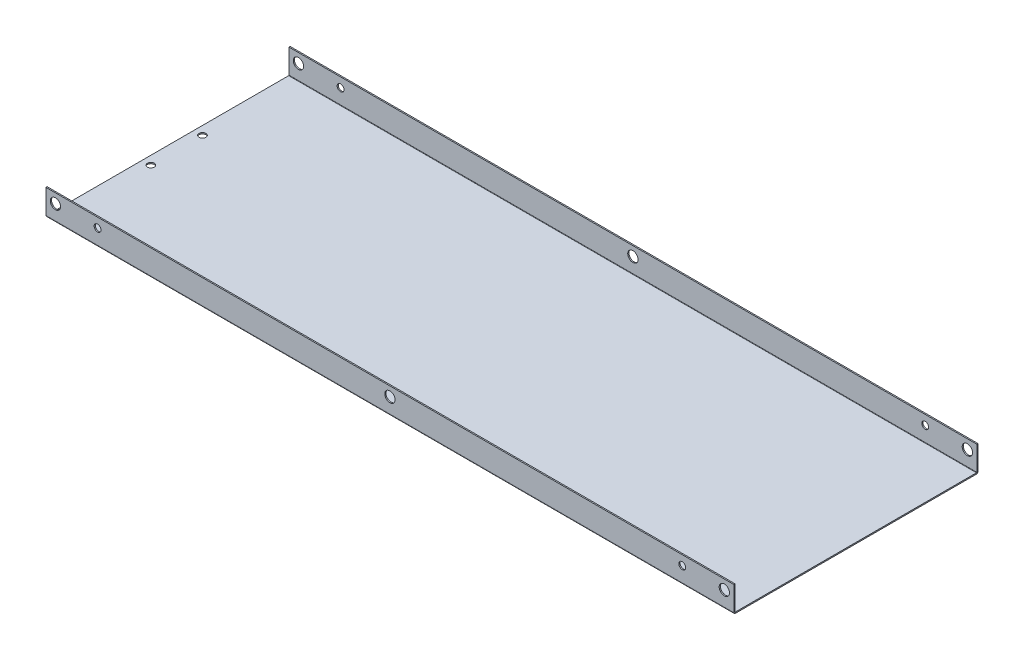
ISO-10303-21;
HEADER;
FILE_DESCRIPTION(('STEP AP214'),'2;1');
FILE_NAME('part.step','',(''),(''),'','','');
FILE_SCHEMA(('AUTOMOTIVE_DESIGN { 1 0 10303 214 1 1 1 1 }'));
ENDSEC;
DATA;
#1=APPLICATION_CONTEXT('core data for automotive mechanical design processes');
#2=APPLICATION_PROTOCOL_DEFINITION('international standard','automotive_design',2000,#1);
#3=PRODUCT_CONTEXT('',#1,'mechanical');
#4=PRODUCT('Part','Part','',(#3));
#5=PRODUCT_RELATED_PRODUCT_CATEGORY('part','',(#4));
#6=PRODUCT_DEFINITION_FORMATION('','',#4);
#7=PRODUCT_DEFINITION_CONTEXT('part definition',#1,'design');
#8=PRODUCT_DEFINITION('design','',#6,#7);
#9=PRODUCT_DEFINITION_SHAPE('','',#8);
#10=(LENGTH_UNIT() NAMED_UNIT(*) SI_UNIT(.MILLI.,.METRE.));
#11=(NAMED_UNIT(*) PLANE_ANGLE_UNIT() SI_UNIT($,.RADIAN.));
#12=(NAMED_UNIT(*) SI_UNIT($,.STERADIAN.) SOLID_ANGLE_UNIT());
#13=UNCERTAINTY_MEASURE_WITH_UNIT(LENGTH_MEASURE(1.E-05),#10,'distance_accuracy_value','');
#14=(GEOMETRIC_REPRESENTATION_CONTEXT(3) GLOBAL_UNCERTAINTY_ASSIGNED_CONTEXT((#13)) GLOBAL_UNIT_ASSIGNED_CONTEXT((#10,
#11,#12)) REPRESENTATION_CONTEXT('',''));
#15=CARTESIAN_POINT('',(0.,0.,0.));
#16=DIRECTION('',(0.,0.,1.));
#17=DIRECTION('',(1.,0.,0.));
#18=AXIS2_PLACEMENT_3D('',#15,#16,#17);
#19=CARTESIAN_POINT('',(0.,-0.7,0.));
#20=DIRECTION('',(0.,-1.,0.));
#21=DIRECTION('',(0.,0.,-1.));
#22=AXIS2_PLACEMENT_3D('',#19,#20,#21);
#23=PLANE('',#22);
#24=CARTESIAN_POINT('',(-195.,-0.699999999999999,-15.));
#25=DIRECTION('',(0.,-1.,0.));
#26=DIRECTION('',(0.,0.,-1.));
#27=AXIS2_PLACEMENT_3D('',#24,#25,#26);
#28=CIRCLE('',#27,2.);
#29=CARTESIAN_POINT('',(-195.,-0.699999999999999,-17.));
#30=VERTEX_POINT('',#29);
#31=EDGE_CURVE('E328',#30,#30,#28,.T.);
#32=ORIENTED_EDGE('',*,*,#31,.F.);
#33=EDGE_LOOP('',(#32));
#34=FACE_BOUND('',#33,.T.);
#35=CARTESIAN_POINT('',(-195.,-0.699999999999999,15.));
#36=DIRECTION('',(0.,-1.,0.));
#37=DIRECTION('',(0.,0.,-1.));
#38=AXIS2_PLACEMENT_3D('',#35,#36,#37);
#39=CIRCLE('',#38,2.);
#40=CARTESIAN_POINT('',(-195.,-0.699999999999999,13.));
#41=VERTEX_POINT('',#40);
#42=EDGE_CURVE('E556',#41,#41,#39,.T.);
#43=ORIENTED_EDGE('',*,*,#42,.F.);
#44=EDGE_LOOP('',(#43));
#45=FACE_BOUND('',#44,.T.);
#46=DIRECTION('',(0.,0.,-1.));
#47=VECTOR('',#46,1.);
#48=CARTESIAN_POINT('',(200.,-0.7,71.));
#49=LINE('',#48,#47);
#50=CARTESIAN_POINT('',(200.,-0.699999999999993,70.1));
#51=VERTEX_POINT('',#50);
#52=CARTESIAN_POINT('',(200.,-0.7,-70.1));
#53=VERTEX_POINT('',#52);
#54=EDGE_CURVE('E85',#51,#53,#49,.T.);
#55=ORIENTED_EDGE('',*,*,#54,.F.);
#56=DIRECTION('',(1.,0.,0.));
#57=VECTOR('',#56,1.);
#58=CARTESIAN_POINT('',(200.,-0.699999999999993,70.1));
#59=LINE('',#58,#57);
#60=CARTESIAN_POINT('',(-200.,-0.7,70.1));
#61=VERTEX_POINT('',#60);
#62=EDGE_CURVE('E210',#51,#61,#59,.F.);
#63=ORIENTED_EDGE('',*,*,#62,.T.);
#64=DIRECTION('',(0.,0.,1.));
#65=VECTOR('',#64,1.);
#66=CARTESIAN_POINT('',(-200.,-0.7,71.));
#67=LINE('',#66,#65);
#68=CARTESIAN_POINT('',(-200.,-0.700000000000022,-70.1));
#69=VERTEX_POINT('',#68);
#70=EDGE_CURVE('E13',#69,#61,#67,.T.);
#71=ORIENTED_EDGE('',*,*,#70,.F.);
#72=DIRECTION('',(-1.,0.,0.));
#73=VECTOR('',#72,1.);
#74=CARTESIAN_POINT('',(-200.,-0.700000000000022,-70.1));
#75=LINE('',#74,#73);
#76=EDGE_CURVE('E261',#69,#53,#75,.F.);
#77=ORIENTED_EDGE('',*,*,#76,.T.);
#78=EDGE_LOOP('',(#55,#63,#71,#77));
#79=FACE_BOUND('',#78,.T.);
#80=ADVANCED_FACE('F76',(#34,#45,#79),#23,.T.);
#81=CARTESIAN_POINT('',(0.,0.,0.));
#82=DIRECTION('',(0.,-1.,0.));
#83=DIRECTION('',(0.,0.,-1.));
#84=AXIS2_PLACEMENT_3D('',#81,#82,#83);
#85=PLANE('',#84);
#86=CARTESIAN_POINT('',(-195.,0.,-15.));
#87=DIRECTION('',(0.,1.,0.));
#88=DIRECTION('',(0.,0.,1.));
#89=AXIS2_PLACEMENT_3D('',#86,#87,#88);
#90=CIRCLE('',#89,2.);
#91=CARTESIAN_POINT('',(-195.,0.,-13.));
#92=VERTEX_POINT('',#91);
#93=EDGE_CURVE('E555',#92,#92,#90,.T.);
#94=ORIENTED_EDGE('',*,*,#93,.F.);
#95=EDGE_LOOP('',(#94));
#96=FACE_BOUND('',#95,.T.);
#97=CARTESIAN_POINT('',(-195.,0.,15.));
#98=DIRECTION('',(0.,1.,0.));
#99=DIRECTION('',(0.,0.,-1.));
#100=AXIS2_PLACEMENT_3D('',#97,#98,#99);
#101=CIRCLE('',#100,2.);
#102=CARTESIAN_POINT('',(-195.,0.,13.));
#103=VERTEX_POINT('',#102);
#104=EDGE_CURVE('E557',#103,#103,#101,.T.);
#105=ORIENTED_EDGE('',*,*,#104,.F.);
#106=EDGE_LOOP('',(#105));
#107=FACE_BOUND('',#106,.T.);
#108=DIRECTION('',(1.,0.,0.));
#109=VECTOR('',#108,1.);
#110=CARTESIAN_POINT('',(200.,0.,70.1));
#111=LINE('',#110,#109);
#112=CARTESIAN_POINT('',(200.,0.,70.1));
#113=VERTEX_POINT('',#112);
#114=CARTESIAN_POINT('',(-200.,0.,70.1));
#115=VERTEX_POINT('',#114);
#116=EDGE_CURVE('E221',#113,#115,#111,.F.);
#117=ORIENTED_EDGE('',*,*,#116,.F.);
#118=DIRECTION('',(0.,0.,-1.));
#119=VECTOR('',#118,1.);
#120=CARTESIAN_POINT('',(200.,0.,71.));
#121=LINE('',#120,#119);
#122=CARTESIAN_POINT('',(200.,0.,-70.1));
#123=VERTEX_POINT('',#122);
#124=EDGE_CURVE('E278',#113,#123,#121,.T.);
#125=ORIENTED_EDGE('',*,*,#124,.T.);
#126=DIRECTION('',(-1.,0.,0.));
#127=VECTOR('',#126,1.);
#128=CARTESIAN_POINT('',(-200.,0.,-70.1));
#129=LINE('',#128,#127);
#130=CARTESIAN_POINT('',(-200.,0.,-70.1));
#131=VERTEX_POINT('',#130);
#132=EDGE_CURVE('E272',#131,#123,#129,.F.);
#133=ORIENTED_EDGE('',*,*,#132,.F.);
#134=DIRECTION('',(0.,0.,1.));
#135=VECTOR('',#134,1.);
#136=CARTESIAN_POINT('',(-200.,0.,71.));
#137=LINE('',#136,#135);
#138=EDGE_CURVE('E282',#131,#115,#137,.T.);
#139=ORIENTED_EDGE('',*,*,#138,.T.);
#140=EDGE_LOOP('',(#117,#125,#133,#139));
#141=FACE_BOUND('',#140,.T.);
#142=ADVANCED_FACE('F376',(#96,#107,#141),#85,.F.);
#143=CARTESIAN_POINT('',(200.,-0.7,71.));
#144=DIRECTION('',(1.,0.,0.));
#145=DIRECTION('',(0.,0.,-1.));
#146=AXIS2_PLACEMENT_3D('',#143,#144,#145);
#147=PLANE('',#146);
#148=ORIENTED_EDGE('',*,*,#124,.F.);
#149=DIRECTION('',(0.,-1.,0.));
#150=VECTOR('',#149,1.);
#151=CARTESIAN_POINT('',(200.,0.,70.1));
#152=LINE('',#151,#150);
#153=EDGE_CURVE('E215',#113,#51,#152,.T.);
#154=ORIENTED_EDGE('',*,*,#153,.T.);
#155=ORIENTED_EDGE('',*,*,#54,.T.);
#156=DIRECTION('',(0.,-1.,0.));
#157=VECTOR('',#156,1.);
#158=CARTESIAN_POINT('',(200.,0.,-70.1));
#159=LINE('',#158,#157);
#160=EDGE_CURVE('E276',#123,#53,#159,.T.);
#161=ORIENTED_EDGE('',*,*,#160,.F.);
#162=EDGE_LOOP('',(#148,#154,#155,#161));
#163=FACE_BOUND('',#162,.T.);
#164=ADVANCED_FACE('F78',(#163),#147,.T.);
#165=CARTESIAN_POINT('',(-200.,-0.7,71.));
#166=DIRECTION('',(-1.,0.,0.));
#167=DIRECTION('',(0.,0.,1.));
#168=AXIS2_PLACEMENT_3D('',#165,#166,#167);
#169=PLANE('',#168);
#170=DIRECTION('',(0.,-1.,0.));
#171=VECTOR('',#170,1.);
#172=CARTESIAN_POINT('',(-200.,0.,70.1));
#173=LINE('',#172,#171);
#174=EDGE_CURVE('E226',#115,#61,#173,.T.);
#175=ORIENTED_EDGE('',*,*,#174,.F.);
#176=ORIENTED_EDGE('',*,*,#138,.F.);
#177=DIRECTION('',(0.,-1.,0.));
#178=VECTOR('',#177,1.);
#179=CARTESIAN_POINT('',(-200.,0.,-70.1));
#180=LINE('',#179,#178);
#181=EDGE_CURVE('E266',#131,#69,#180,.T.);
#182=ORIENTED_EDGE('',*,*,#181,.T.);
#183=ORIENTED_EDGE('',*,*,#70,.T.);
#184=EDGE_LOOP('',(#175,#176,#182,#183));
#185=FACE_BOUND('',#184,.T.);
#186=ADVANCED_FACE('F389',(#185),#169,.T.);
#187=CARTESIAN_POINT('',(200.,0.200000000000011,-70.1));
#188=DIRECTION('',(1.,0.,0.));
#189=DIRECTION('',(0.,1.,0.));
#190=AXIS2_PLACEMENT_3D('',#187,#188,#189);
#191=PLANE('',#190);
#192=DIRECTION('',(0.,0.,1.));
#193=VECTOR('',#192,1.);
#194=CARTESIAN_POINT('',(200.,0.200000000000011,-71.));
#195=LINE('',#194,#193);
#196=CARTESIAN_POINT('',(200.,0.20000000000001,-70.3));
#197=VERTEX_POINT('',#196);
#198=CARTESIAN_POINT('',(200.,0.200000000000007,-71.));
#199=VERTEX_POINT('',#198);
#200=EDGE_CURVE('E228',#197,#199,#195,.F.);
#201=ORIENTED_EDGE('',*,*,#200,.F.);
#202=CARTESIAN_POINT('',(200.,0.200000000000011,-70.1));
#203=DIRECTION('',(-1.,0.,0.));
#204=DIRECTION('',(0.,-1.,0.));
#205=AXIS2_PLACEMENT_3D('',#202,#203,#204);
#206=CIRCLE('',#205,0.200000000000006);
#207=EDGE_CURVE('E269',#123,#197,#206,.F.);
#208=ORIENTED_EDGE('',*,*,#207,.F.);
#209=ORIENTED_EDGE('',*,*,#160,.T.);
#210=CARTESIAN_POINT('',(200.,0.200000000000011,-70.1));
#211=DIRECTION('',(-1.,0.,0.));
#212=DIRECTION('',(0.,-1.,0.));
#213=AXIS2_PLACEMENT_3D('',#210,#211,#212);
#214=CIRCLE('',#213,0.900000000000006);
#215=EDGE_CURVE('E93',#53,#199,#214,.F.);
#216=ORIENTED_EDGE('',*,*,#215,.T.);
#217=EDGE_LOOP('',(#201,#208,#209,#216));
#218=FACE_BOUND('',#217,.T.);
#219=ADVANCED_FACE('F391',(#218),#191,.T.);
#220=CARTESIAN_POINT('',(-200.,0.199999999999984,-70.1));
#221=DIRECTION('',(1.,0.,0.));
#222=DIRECTION('',(0.,1.,0.));
#223=AXIS2_PLACEMENT_3D('',#220,#221,#222);
#224=PLANE('',#223);
#225=CARTESIAN_POINT('',(-200.,0.199999999999984,-70.1));
#226=DIRECTION('',(-1.,0.,0.));
#227=DIRECTION('',(0.,-1.,0.));
#228=AXIS2_PLACEMENT_3D('',#225,#226,#227);
#229=CIRCLE('',#228,0.200000000000006);
#230=CARTESIAN_POINT('',(-200.,0.199999999999983,-70.3));
#231=VERTEX_POINT('',#230);
#232=EDGE_CURVE('E234',#231,#131,#229,.T.);
#233=ORIENTED_EDGE('',*,*,#232,.F.);
#234=DIRECTION('',(0.,0.,1.));
#235=VECTOR('',#234,1.);
#236=CARTESIAN_POINT('',(-200.,0.199999999999992,-70.3));
#237=LINE('',#236,#235);
#238=CARTESIAN_POINT('',(-200.,0.199999999999997,-71.));
#239=VERTEX_POINT('',#238);
#240=EDGE_CURVE('E254',#231,#239,#237,.F.);
#241=ORIENTED_EDGE('',*,*,#240,.T.);
#242=CARTESIAN_POINT('',(-200.,0.199999999999984,-70.1));
#243=DIRECTION('',(-1.,0.,0.));
#244=DIRECTION('',(0.,-1.,0.));
#245=AXIS2_PLACEMENT_3D('',#242,#243,#244);
#246=CIRCLE('',#245,0.900000000000006);
#247=EDGE_CURVE('E264',#239,#69,#246,.T.);
#248=ORIENTED_EDGE('',*,*,#247,.T.);
#249=ORIENTED_EDGE('',*,*,#181,.F.);
#250=EDGE_LOOP('',(#233,#241,#248,#249));
#251=FACE_BOUND('',#250,.T.);
#252=ADVANCED_FACE('F387',(#251),#224,.F.);
#253=CARTESIAN_POINT('',(-200.,0.199999999999984,-70.1));
#254=DIRECTION('',(-1.,0.,0.));
#255=DIRECTION('',(0.,0.,-1.));
#256=AXIS2_PLACEMENT_3D('',#253,#254,#255);
#257=CYLINDRICAL_SURFACE('',#256,0.900000000000006);
#258=ORIENTED_EDGE('',*,*,#76,.F.);
#259=ORIENTED_EDGE('',*,*,#247,.F.);
#260=DIRECTION('',(-1.,0.,0.));
#261=VECTOR('',#260,1.);
#262=CARTESIAN_POINT('',(200.,0.200000000000011,-71.));
#263=LINE('',#262,#261);
#264=EDGE_CURVE('E252',#239,#199,#263,.F.);
#265=ORIENTED_EDGE('',*,*,#264,.T.);
#266=ORIENTED_EDGE('',*,*,#215,.F.);
#267=EDGE_LOOP('',(#258,#259,#265,#266));
#268=FACE_BOUND('',#267,.T.);
#269=ADVANCED_FACE('F440',(#268),#257,.T.);
#270=CARTESIAN_POINT('',(-200.,0.199999999999984,-70.1));
#271=DIRECTION('',(-1.,0.,0.));
#272=DIRECTION('',(0.,0.,-1.));
#273=AXIS2_PLACEMENT_3D('',#270,#271,#272);
#274=CYLINDRICAL_SURFACE('',#273,0.200000000000006);
#275=ORIENTED_EDGE('',*,*,#132,.T.);
#276=ORIENTED_EDGE('',*,*,#207,.T.);
#277=DIRECTION('',(-1.,0.,0.));
#278=VECTOR('',#277,1.);
#279=CARTESIAN_POINT('',(200.,0.200000000000006,-70.3));
#280=LINE('',#279,#278);
#281=EDGE_CURVE('E257',#197,#231,#280,.T.);
#282=ORIENTED_EDGE('',*,*,#281,.T.);
#283=ORIENTED_EDGE('',*,*,#232,.T.);
#284=EDGE_LOOP('',(#275,#276,#282,#283));
#285=FACE_BOUND('',#284,.T.);
#286=ADVANCED_FACE('F409',(#285),#274,.F.);
#287=CARTESIAN_POINT('',(-200.,14.3,-71.));
#288=DIRECTION('',(1.,0.,0.));
#289=DIRECTION('',(0.,0.,-1.));
#290=AXIS2_PLACEMENT_3D('',#287,#288,#289);
#291=PLANE('',#290);
#292=ORIENTED_EDGE('',*,*,#240,.F.);
#293=DIRECTION('',(0.,-1.,0.));
#294=VECTOR('',#293,1.);
#295=CARTESIAN_POINT('',(-200.,14.3,-70.3));
#296=LINE('',#295,#294);
#297=CARTESIAN_POINT('',(-200.,14.3,-70.3));
#298=VERTEX_POINT('',#297);
#299=EDGE_CURVE('E250',#231,#298,#296,.F.);
#300=ORIENTED_EDGE('',*,*,#299,.T.);
#301=DIRECTION('',(0.,0.,1.));
#302=VECTOR('',#301,1.);
#303=CARTESIAN_POINT('',(-200.,14.3,-71.));
#304=LINE('',#303,#302);
#305=CARTESIAN_POINT('',(-200.,14.3,-71.));
#306=VERTEX_POINT('',#305);
#307=EDGE_CURVE('E231',#306,#298,#304,.T.);
#308=ORIENTED_EDGE('',*,*,#307,.F.);
#309=DIRECTION('',(0.,1.,0.));
#310=VECTOR('',#309,1.);
#311=CARTESIAN_POINT('',(-200.,-2.78058843749729E-13,-71.));
#312=LINE('',#311,#310);
#313=EDGE_CURVE('E243',#239,#306,#312,.T.);
#314=ORIENTED_EDGE('',*,*,#313,.F.);
#315=EDGE_LOOP('',(#292,#300,#308,#314));
#316=FACE_BOUND('',#315,.T.);
#317=ADVANCED_FACE('F432',(#316),#291,.F.);
#318=CARTESIAN_POINT('',(200.,0.,-71.));
#319=DIRECTION('',(-1.,0.,0.));
#320=DIRECTION('',(0.,-1.,0.));
#321=AXIS2_PLACEMENT_3D('',#318,#319,#320);
#322=PLANE('',#321);
#323=ORIENTED_EDGE('',*,*,#200,.T.);
#324=DIRECTION('',(0.,-1.,0.));
#325=VECTOR('',#324,1.);
#326=CARTESIAN_POINT('',(200.,-6.66248712499784E-13,-71.));
#327=LINE('',#326,#325);
#328=CARTESIAN_POINT('',(200.,14.3,-71.));
#329=VERTEX_POINT('',#328);
#330=EDGE_CURVE('E238',#329,#199,#327,.T.);
#331=ORIENTED_EDGE('',*,*,#330,.F.);
#332=DIRECTION('',(0.,0.,1.));
#333=VECTOR('',#332,1.);
#334=CARTESIAN_POINT('',(200.,14.3,-71.));
#335=LINE('',#334,#333);
#336=CARTESIAN_POINT('',(200.,14.3,-70.3));
#337=VERTEX_POINT('',#336);
#338=EDGE_CURVE('E235',#329,#337,#335,.T.);
#339=ORIENTED_EDGE('',*,*,#338,.T.);
#340=DIRECTION('',(0.,1.,0.));
#341=VECTOR('',#340,1.);
#342=CARTESIAN_POINT('',(200.,0.,-70.3));
#343=LINE('',#342,#341);
#344=EDGE_CURVE('E245',#337,#197,#343,.F.);
#345=ORIENTED_EDGE('',*,*,#344,.T.);
#346=EDGE_LOOP('',(#323,#331,#339,#345));
#347=FACE_BOUND('',#346,.T.);
#348=ADVANCED_FACE('F414',(#347),#322,.F.);
#349=CARTESIAN_POINT('',(0.,-2.78058843749729E-13,-71.));
#350=DIRECTION('',(0.,0.,1.));
#351=DIRECTION('',(0.,-1.,0.));
#352=AXIS2_PLACEMENT_3D('',#349,#350,#351);
#353=PLANE('',#352);
#354=CARTESIAN_POINT('',(170.,8.80000000000001,-71.));
#355=DIRECTION('',(0.,0.,-1.));
#356=DIRECTION('',(0.,1.,0.));
#357=AXIS2_PLACEMENT_3D('',#354,#355,#356);
#358=CIRCLE('',#357,2.);
#359=CARTESIAN_POINT('',(170.,10.8,-71.));
#360=VERTEX_POINT('',#359);
#361=EDGE_CURVE('E312',#360,#360,#358,.T.);
#362=ORIENTED_EDGE('',*,*,#361,.F.);
#363=EDGE_LOOP('',(#362));
#364=FACE_BOUND('',#363,.T.);
#365=CARTESIAN_POINT('',(-170.,8.80000000000005,-71.));
#366=DIRECTION('',(0.,0.,-1.));
#367=DIRECTION('',(0.,-1.,0.));
#368=AXIS2_PLACEMENT_3D('',#365,#366,#367);
#369=CIRCLE('',#368,2.);
#370=CARTESIAN_POINT('',(-170.,6.80000000000005,-71.));
#371=VERTEX_POINT('',#370);
#372=EDGE_CURVE('E321',#371,#371,#369,.T.);
#373=ORIENTED_EDGE('',*,*,#372,.F.);
#374=EDGE_LOOP('',(#373));
#375=FACE_BOUND('',#374,.T.);
#376=CARTESIAN_POINT('',(194.5,8.8,-71.));
#377=DIRECTION('',(0.,0.,-1.));
#378=DIRECTION('',(0.,1.,0.));
#379=AXIS2_PLACEMENT_3D('',#376,#377,#378);
#380=CIRCLE('',#379,2.99999999999999);
#381=CARTESIAN_POINT('',(194.5,11.8,-71.));
#382=VERTEX_POINT('',#381);
#383=EDGE_CURVE('E292',#382,#382,#380,.T.);
#384=ORIENTED_EDGE('',*,*,#383,.F.);
#385=EDGE_LOOP('',(#384));
#386=FACE_BOUND('',#385,.T.);
#387=CARTESIAN_POINT('',(0.,8.80000000000001,-71.));
#388=DIRECTION('',(0.,0.,-1.));
#389=DIRECTION('',(0.,1.,0.));
#390=AXIS2_PLACEMENT_3D('',#387,#388,#389);
#391=CIRCLE('',#390,3.);
#392=CARTESIAN_POINT('',(0.,11.8,-71.));
#393=VERTEX_POINT('',#392);
#394=EDGE_CURVE('E346',#393,#393,#391,.T.);
#395=ORIENTED_EDGE('',*,*,#394,.F.);
#396=EDGE_LOOP('',(#395));
#397=FACE_BOUND('',#396,.T.);
#398=CARTESIAN_POINT('',(-194.5,8.80000000000005,-71.));
#399=DIRECTION('',(0.,0.,-1.));
#400=DIRECTION('',(0.,-1.,0.));
#401=AXIS2_PLACEMENT_3D('',#398,#399,#400);
#402=CIRCLE('',#401,2.99999999999999);
#403=CARTESIAN_POINT('',(-194.5,5.80000000000005,-71.));
#404=VERTEX_POINT('',#403);
#405=EDGE_CURVE('E307',#404,#404,#402,.T.);
#406=ORIENTED_EDGE('',*,*,#405,.F.);
#407=EDGE_LOOP('',(#406));
#408=FACE_BOUND('',#407,.T.);
#409=ORIENTED_EDGE('',*,*,#264,.F.);
#410=ORIENTED_EDGE('',*,*,#313,.T.);
#411=DIRECTION('',(1.,0.,0.));
#412=VECTOR('',#411,1.);
#413=CARTESIAN_POINT('',(0.,14.3,-71.));
#414=LINE('',#413,#412);
#415=EDGE_CURVE('E241',#306,#329,#414,.T.);
#416=ORIENTED_EDGE('',*,*,#415,.T.);
#417=ORIENTED_EDGE('',*,*,#330,.T.);
#418=EDGE_LOOP('',(#409,#410,#416,#417));
#419=FACE_BOUND('',#418,.T.);
#420=ADVANCED_FACE('F418',(#364,#375,#386,#397,#408,#419),#353,.F.);
#421=CARTESIAN_POINT('',(0.,-2.75614806812539E-13,-70.3));
#422=DIRECTION('',(0.,0.,1.));
#423=DIRECTION('',(0.,-1.,0.));
#424=AXIS2_PLACEMENT_3D('',#421,#422,#423);
#425=PLANE('',#424);
#426=CARTESIAN_POINT('',(170.,8.80000000000001,-70.3));
#427=DIRECTION('',(0.,0.,1.));
#428=DIRECTION('',(0.,-1.,0.));
#429=AXIS2_PLACEMENT_3D('',#426,#427,#428);
#430=CIRCLE('',#429,2.);
#431=CARTESIAN_POINT('',(170.,6.80000000000001,-70.3));
#432=VERTEX_POINT('',#431);
#433=EDGE_CURVE('E311',#432,#432,#430,.T.);
#434=ORIENTED_EDGE('',*,*,#433,.F.);
#435=EDGE_LOOP('',(#434));
#436=FACE_BOUND('',#435,.T.);
#437=CARTESIAN_POINT('',(-170.,8.80000000000005,-70.3));
#438=DIRECTION('',(0.,0.,1.));
#439=DIRECTION('',(0.,-1.,0.));
#440=AXIS2_PLACEMENT_3D('',#437,#438,#439);
#441=CIRCLE('',#440,2.);
#442=CARTESIAN_POINT('',(-170.,6.80000000000005,-70.3));
#443=VERTEX_POINT('',#442);
#444=EDGE_CURVE('E308',#443,#443,#441,.T.);
#445=ORIENTED_EDGE('',*,*,#444,.F.);
#446=EDGE_LOOP('',(#445));
#447=FACE_BOUND('',#446,.T.);
#448=CARTESIAN_POINT('',(194.5,8.8,-70.3));
#449=DIRECTION('',(0.,0.,1.));
#450=DIRECTION('',(0.,-1.,0.));
#451=AXIS2_PLACEMENT_3D('',#448,#449,#450);
#452=CIRCLE('',#451,2.99999999999999);
#453=CARTESIAN_POINT('',(194.5,5.80000000000001,-70.3));
#454=VERTEX_POINT('',#453);
#455=EDGE_CURVE('E209',#454,#454,#452,.T.);
#456=ORIENTED_EDGE('',*,*,#455,.F.);
#457=EDGE_LOOP('',(#456));
#458=FACE_BOUND('',#457,.T.);
#459=CARTESIAN_POINT('',(0.,8.80000000000001,-70.3));
#460=DIRECTION('',(0.,0.,1.));
#461=DIRECTION('',(0.,-1.,0.));
#462=AXIS2_PLACEMENT_3D('',#459,#460,#461);
#463=CIRCLE('',#462,3.);
#464=CARTESIAN_POINT('',(0.,5.80000000000001,-70.3));
#465=VERTEX_POINT('',#464);
#466=EDGE_CURVE('E291',#465,#465,#463,.T.);
#467=ORIENTED_EDGE('',*,*,#466,.F.);
#468=EDGE_LOOP('',(#467));
#469=FACE_BOUND('',#468,.T.);
#470=CARTESIAN_POINT('',(-194.5,8.80000000000005,-70.3));
#471=DIRECTION('',(0.,0.,1.));
#472=DIRECTION('',(0.,-1.,0.));
#473=AXIS2_PLACEMENT_3D('',#470,#471,#472);
#474=CIRCLE('',#473,2.99999999999999);
#475=CARTESIAN_POINT('',(-194.5,5.80000000000005,-70.3));
#476=VERTEX_POINT('',#475);
#477=EDGE_CURVE('E288',#476,#476,#474,.T.);
#478=ORIENTED_EDGE('',*,*,#477,.F.);
#479=EDGE_LOOP('',(#478));
#480=FACE_BOUND('',#479,.T.);
#481=ORIENTED_EDGE('',*,*,#299,.F.);
#482=ORIENTED_EDGE('',*,*,#281,.F.);
#483=ORIENTED_EDGE('',*,*,#344,.F.);
#484=DIRECTION('',(-1.,0.,0.));
#485=VECTOR('',#484,1.);
#486=CARTESIAN_POINT('',(200.,14.3,-70.3));
#487=LINE('',#486,#485);
#488=EDGE_CURVE('E248',#298,#337,#487,.F.);
#489=ORIENTED_EDGE('',*,*,#488,.F.);
#490=EDGE_LOOP('',(#481,#482,#483,#489));
#491=FACE_BOUND('',#490,.T.);
#492=ADVANCED_FACE('F428',(#436,#447,#458,#469,#480,#491),#425,.T.);
#493=CARTESIAN_POINT('',(200.,14.3,-71.));
#494=DIRECTION('',(0.,-1.,0.));
#495=DIRECTION('',(0.,0.,-1.));
#496=AXIS2_PLACEMENT_3D('',#493,#494,#495);
#497=PLANE('',#496);
#498=ORIENTED_EDGE('',*,*,#488,.T.);
#499=ORIENTED_EDGE('',*,*,#338,.F.);
#500=ORIENTED_EDGE('',*,*,#415,.F.);
#501=ORIENTED_EDGE('',*,*,#307,.T.);
#502=EDGE_LOOP('',(#498,#499,#500,#501));
#503=FACE_BOUND('',#502,.T.);
#504=ADVANCED_FACE('F424',(#503),#497,.F.);
#505=CARTESIAN_POINT('',(-200.,0.200000000000013,70.1));
#506=DIRECTION('',(-1.,0.,0.));
#507=DIRECTION('',(0.,0.,1.));
#508=AXIS2_PLACEMENT_3D('',#505,#506,#507);
#509=PLANE('',#508);
#510=DIRECTION('',(0.,0.,-1.));
#511=VECTOR('',#510,1.);
#512=CARTESIAN_POINT('',(-200.,0.200000000000006,71.));
#513=LINE('',#512,#511);
#514=CARTESIAN_POINT('',(-200.,0.200000000000013,70.3));
#515=VERTEX_POINT('',#514);
#516=CARTESIAN_POINT('',(-200.,0.200000000000013,71.));
#517=VERTEX_POINT('',#516);
#518=EDGE_CURVE('E191',#515,#517,#513,.F.);
#519=ORIENTED_EDGE('',*,*,#518,.F.);
#520=CARTESIAN_POINT('',(-200.,0.200000000000013,70.1));
#521=DIRECTION('',(1.,0.,0.));
#522=DIRECTION('',(0.,0.,-1.));
#523=AXIS2_PLACEMENT_3D('',#520,#521,#522);
#524=CIRCLE('',#523,0.200000000000006);
#525=EDGE_CURVE('E218',#115,#515,#524,.F.);
#526=ORIENTED_EDGE('',*,*,#525,.F.);
#527=ORIENTED_EDGE('',*,*,#174,.T.);
#528=CARTESIAN_POINT('',(-200.,0.200000000000013,70.1));
#529=DIRECTION('',(1.,0.,0.));
#530=DIRECTION('',(0.,0.,-1.));
#531=AXIS2_PLACEMENT_3D('',#528,#529,#530);
#532=CIRCLE('',#531,0.900000000000006);
#533=EDGE_CURVE('E101',#61,#517,#532,.F.);
#534=ORIENTED_EDGE('',*,*,#533,.T.);
#535=EDGE_LOOP('',(#519,#526,#527,#534));
#536=FACE_BOUND('',#535,.T.);
#537=ADVANCED_FACE('F450',(#536),#509,.T.);
#538=CARTESIAN_POINT('',(200.,0.200000000000013,70.1));
#539=DIRECTION('',(-1.,0.,0.));
#540=DIRECTION('',(0.,0.,1.));
#541=AXIS2_PLACEMENT_3D('',#538,#539,#540);
#542=PLANE('',#541);
#543=CARTESIAN_POINT('',(200.,0.200000000000013,70.1));
#544=DIRECTION('',(1.,0.,0.));
#545=DIRECTION('',(0.,0.,-1.));
#546=AXIS2_PLACEMENT_3D('',#543,#544,#545);
#547=CIRCLE('',#546,0.200000000000006);
#548=CARTESIAN_POINT('',(200.,0.200000000000013,70.3));
#549=VERTEX_POINT('',#548);
#550=EDGE_CURVE('E223',#549,#113,#547,.T.);
#551=ORIENTED_EDGE('',*,*,#550,.F.);
#552=DIRECTION('',(0.,0.,-1.));
#553=VECTOR('',#552,1.);
#554=CARTESIAN_POINT('',(200.,0.20000000000002,70.3));
#555=LINE('',#554,#553);
#556=CARTESIAN_POINT('',(200.,0.20000000000002,71.));
#557=VERTEX_POINT('',#556);
#558=EDGE_CURVE('E203',#549,#557,#555,.F.);
#559=ORIENTED_EDGE('',*,*,#558,.T.);
#560=CARTESIAN_POINT('',(200.,0.200000000000013,70.1));
#561=DIRECTION('',(1.,0.,0.));
#562=DIRECTION('',(0.,0.,-1.));
#563=AXIS2_PLACEMENT_3D('',#560,#561,#562);
#564=CIRCLE('',#563,0.900000000000006);
#565=EDGE_CURVE('E213',#557,#51,#564,.T.);
#566=ORIENTED_EDGE('',*,*,#565,.T.);
#567=ORIENTED_EDGE('',*,*,#153,.F.);
#568=EDGE_LOOP('',(#551,#559,#566,#567));
#569=FACE_BOUND('',#568,.T.);
#570=ADVANCED_FACE('F362',(#569),#542,.F.);
#571=CARTESIAN_POINT('',(200.,0.200000000000013,70.1));
#572=DIRECTION('',(1.,0.,0.));
#573=DIRECTION('',(0.,0.,1.));
#574=AXIS2_PLACEMENT_3D('',#571,#572,#573);
#575=CYLINDRICAL_SURFACE('',#574,0.900000000000006);
#576=ORIENTED_EDGE('',*,*,#62,.F.);
#577=ORIENTED_EDGE('',*,*,#565,.F.);
#578=DIRECTION('',(1.,0.,0.));
#579=VECTOR('',#578,1.);
#580=CARTESIAN_POINT('',(-200.,0.200000000000006,71.));
#581=LINE('',#580,#579);
#582=EDGE_CURVE('E201',#557,#517,#581,.F.);
#583=ORIENTED_EDGE('',*,*,#582,.T.);
#584=ORIENTED_EDGE('',*,*,#533,.F.);
#585=EDGE_LOOP('',(#576,#577,#583,#584));
#586=FACE_BOUND('',#585,.T.);
#587=ADVANCED_FACE('F371',(#586),#575,.T.);
#588=CARTESIAN_POINT('',(200.,0.200000000000013,70.1));
#589=DIRECTION('',(1.,0.,0.));
#590=DIRECTION('',(0.,0.,1.));
#591=AXIS2_PLACEMENT_3D('',#588,#589,#590);
#592=CYLINDRICAL_SURFACE('',#591,0.200000000000006);
#593=ORIENTED_EDGE('',*,*,#116,.T.);
#594=ORIENTED_EDGE('',*,*,#525,.T.);
#595=DIRECTION('',(1.,0.,0.));
#596=VECTOR('',#595,1.);
#597=CARTESIAN_POINT('',(-200.,0.200000000000006,70.3));
#598=LINE('',#597,#596);
#599=EDGE_CURVE('E206',#515,#549,#598,.T.);
#600=ORIENTED_EDGE('',*,*,#599,.T.);
#601=ORIENTED_EDGE('',*,*,#550,.T.);
#602=EDGE_LOOP('',(#593,#594,#600,#601));
#603=FACE_BOUND('',#602,.T.);
#604=ADVANCED_FACE('F357',(#603),#592,.F.);
#605=CARTESIAN_POINT('',(200.,14.3,71.));
#606=DIRECTION('',(-1.,0.,0.));
#607=DIRECTION('',(0.,-1.,0.));
#608=AXIS2_PLACEMENT_3D('',#605,#606,#607);
#609=PLANE('',#608);
#610=ORIENTED_EDGE('',*,*,#558,.F.);
#611=DIRECTION('',(0.,-1.,0.));
#612=VECTOR('',#611,1.);
#613=CARTESIAN_POINT('',(200.,14.3,70.3));
#614=LINE('',#613,#612);
#615=CARTESIAN_POINT('',(200.,14.3,70.3));
#616=VERTEX_POINT('',#615);
#617=EDGE_CURVE('E199',#549,#616,#614,.F.);
#618=ORIENTED_EDGE('',*,*,#617,.T.);
#619=DIRECTION('',(0.,0.,-1.));
#620=VECTOR('',#619,1.);
#621=CARTESIAN_POINT('',(200.,14.3,71.));
#622=LINE('',#621,#620);
#623=CARTESIAN_POINT('',(200.,14.3,71.));
#624=VERTEX_POINT('',#623);
#625=EDGE_CURVE('E187',#624,#616,#622,.T.);
#626=ORIENTED_EDGE('',*,*,#625,.F.);
#627=DIRECTION('',(0.,1.,0.));
#628=VECTOR('',#627,1.);
#629=CARTESIAN_POINT('',(200.,-3.88189868750055E-13,71.));
#630=LINE('',#629,#628);
#631=EDGE_CURVE('E174',#557,#624,#630,.T.);
#632=ORIENTED_EDGE('',*,*,#631,.F.);
#633=EDGE_LOOP('',(#610,#618,#626,#632));
#634=FACE_BOUND('',#633,.T.);
#635=ADVANCED_FACE('F363',(#634),#609,.F.);
#636=CARTESIAN_POINT('',(-200.,0.,71.));
#637=DIRECTION('',(1.,0.,0.));
#638=DIRECTION('',(0.,0.,-1.));
#639=AXIS2_PLACEMENT_3D('',#636,#637,#638);
#640=PLANE('',#639);
#641=ORIENTED_EDGE('',*,*,#518,.T.);
#642=DIRECTION('',(0.,-1.,0.));
#643=VECTOR('',#642,1.);
#644=CARTESIAN_POINT('',(-200.,0.,71.));
#645=LINE('',#644,#643);
#646=CARTESIAN_POINT('',(-200.,14.3,71.));
#647=VERTEX_POINT('',#646);
#648=EDGE_CURVE('E172',#647,#517,#645,.T.);
#649=ORIENTED_EDGE('',*,*,#648,.F.);
#650=DIRECTION('',(0.,0.,-1.));
#651=VECTOR('',#650,1.);
#652=CARTESIAN_POINT('',(-200.,14.3,71.));
#653=LINE('',#652,#651);
#654=CARTESIAN_POINT('',(-200.,14.3,70.3));
#655=VERTEX_POINT('',#654);
#656=EDGE_CURVE('E180',#647,#655,#653,.T.);
#657=ORIENTED_EDGE('',*,*,#656,.T.);
#658=DIRECTION('',(0.,1.,0.));
#659=VECTOR('',#658,1.);
#660=CARTESIAN_POINT('',(-200.,0.,70.3));
#661=LINE('',#660,#659);
#662=EDGE_CURVE('E196',#655,#515,#661,.F.);
#663=ORIENTED_EDGE('',*,*,#662,.T.);
#664=EDGE_LOOP('',(#641,#649,#657,#663));
#665=FACE_BOUND('',#664,.T.);
#666=ADVANCED_FACE('F190',(#665),#640,.F.);
#667=CARTESIAN_POINT('',(0.,0.,71.));
#668=DIRECTION('',(0.,0.,-1.));
#669=DIRECTION('',(-1.,0.,0.));
#670=AXIS2_PLACEMENT_3D('',#667,#668,#669);
#671=PLANE('',#670);
#672=CARTESIAN_POINT('',(-170.,8.80000000000001,71.));
#673=DIRECTION('',(0.,0.,1.));
#674=DIRECTION('',(1.,0.,0.));
#675=AXIS2_PLACEMENT_3D('',#672,#673,#674);
#676=CIRCLE('',#675,2.);
#677=CARTESIAN_POINT('',(-168.,8.80000000000001,71.));
#678=VERTEX_POINT('',#677);
#679=EDGE_CURVE('E317',#678,#678,#676,.T.);
#680=ORIENTED_EDGE('',*,*,#679,.F.);
#681=EDGE_LOOP('',(#680));
#682=FACE_BOUND('',#681,.T.);
#683=CARTESIAN_POINT('',(170.,8.80000000000005,71.));
#684=DIRECTION('',(0.,0.,1.));
#685=DIRECTION('',(-1.,0.,0.));
#686=AXIS2_PLACEMENT_3D('',#683,#684,#685);
#687=CIRCLE('',#686,2.);
#688=CARTESIAN_POINT('',(168.,8.80000000000005,71.));
#689=VERTEX_POINT('',#688);
#690=EDGE_CURVE('E323',#689,#689,#687,.T.);
#691=ORIENTED_EDGE('',*,*,#690,.F.);
#692=EDGE_LOOP('',(#691));
#693=FACE_BOUND('',#692,.T.);
#694=CARTESIAN_POINT('',(-194.5,8.8,71.));
#695=DIRECTION('',(0.,0.,1.));
#696=DIRECTION('',(1.,0.,0.));
#697=AXIS2_PLACEMENT_3D('',#694,#695,#696);
#698=CIRCLE('',#697,2.99999999999999);
#699=CARTESIAN_POINT('',(-191.5,8.8,71.));
#700=VERTEX_POINT('',#699);
#701=EDGE_CURVE('E301',#700,#700,#698,.T.);
#702=ORIENTED_EDGE('',*,*,#701,.F.);
#703=EDGE_LOOP('',(#702));
#704=FACE_BOUND('',#703,.T.);
#705=CARTESIAN_POINT('',(0.,8.80000000000001,71.));
#706=DIRECTION('',(0.,0.,1.));
#707=DIRECTION('',(1.,0.,0.));
#708=AXIS2_PLACEMENT_3D('',#705,#706,#707);
#709=CIRCLE('',#708,3.);
#710=CARTESIAN_POINT('',(3.,8.80000000000001,71.));
#711=VERTEX_POINT('',#710);
#712=EDGE_CURVE('E339',#711,#711,#709,.T.);
#713=ORIENTED_EDGE('',*,*,#712,.F.);
#714=EDGE_LOOP('',(#713));
#715=FACE_BOUND('',#714,.T.);
#716=CARTESIAN_POINT('',(194.5,8.80000000000005,71.));
#717=DIRECTION('',(0.,0.,1.));
#718=DIRECTION('',(-1.,0.,0.));
#719=AXIS2_PLACEMENT_3D('',#716,#717,#718);
#720=CIRCLE('',#719,2.99999999999999);
#721=CARTESIAN_POINT('',(191.5,8.80000000000005,71.));
#722=VERTEX_POINT('',#721);
#723=EDGE_CURVE('E314',#722,#722,#720,.T.);
#724=ORIENTED_EDGE('',*,*,#723,.F.);
#725=EDGE_LOOP('',(#724));
#726=FACE_BOUND('',#725,.T.);
#727=ORIENTED_EDGE('',*,*,#582,.F.);
#728=ORIENTED_EDGE('',*,*,#631,.T.);
#729=DIRECTION('',(-1.,0.,0.));
#730=VECTOR('',#729,1.);
#731=CARTESIAN_POINT('',(0.,14.3,71.));
#732=LINE('',#731,#730);
#733=EDGE_CURVE('E167',#624,#647,#732,.T.);
#734=ORIENTED_EDGE('',*,*,#733,.T.);
#735=ORIENTED_EDGE('',*,*,#648,.T.);
#736=EDGE_LOOP('',(#727,#728,#734,#735));
#737=FACE_BOUND('',#736,.T.);
#738=ADVANCED_FACE('F170',(#682,#693,#704,#715,#726,#737),#671,.F.);
#739=CARTESIAN_POINT('',(0.,0.,70.3));
#740=DIRECTION('',(0.,0.,-1.));
#741=DIRECTION('',(-1.,0.,0.));
#742=AXIS2_PLACEMENT_3D('',#739,#740,#741);
#743=PLANE('',#742);
#744=CARTESIAN_POINT('',(-170.,8.80000000000001,70.3));
#745=DIRECTION('',(0.,0.,-1.));
#746=DIRECTION('',(-1.,0.,0.));
#747=AXIS2_PLACEMENT_3D('',#744,#745,#746);
#748=CIRCLE('',#747,2.);
#749=CARTESIAN_POINT('',(-172.,8.80000000000001,70.3));
#750=VERTEX_POINT('',#749);
#751=EDGE_CURVE('E80',#750,#750,#748,.T.);
#752=ORIENTED_EDGE('',*,*,#751,.F.);
#753=EDGE_LOOP('',(#752));
#754=FACE_BOUND('',#753,.T.);
#755=CARTESIAN_POINT('',(170.,8.80000000000005,70.3));
#756=DIRECTION('',(0.,0.,-1.));
#757=DIRECTION('',(-1.,0.,0.));
#758=AXIS2_PLACEMENT_3D('',#755,#756,#757);
#759=CIRCLE('',#758,2.);
#760=CARTESIAN_POINT('',(168.,8.80000000000005,70.3));
#761=VERTEX_POINT('',#760);
#762=EDGE_CURVE('E315',#761,#761,#759,.T.);
#763=ORIENTED_EDGE('',*,*,#762,.F.);
#764=EDGE_LOOP('',(#763));
#765=FACE_BOUND('',#764,.T.);
#766=CARTESIAN_POINT('',(-194.5,8.8,70.3));
#767=DIRECTION('',(0.,0.,-1.));
#768=DIRECTION('',(-1.,0.,0.));
#769=AXIS2_PLACEMENT_3D('',#766,#767,#768);
#770=CIRCLE('',#769,2.99999999999999);
#771=CARTESIAN_POINT('',(-197.5,8.8,70.3));
#772=VERTEX_POINT('',#771);
#773=EDGE_CURVE('E304',#772,#772,#770,.T.);
#774=ORIENTED_EDGE('',*,*,#773,.F.);
#775=EDGE_LOOP('',(#774));
#776=FACE_BOUND('',#775,.T.);
#777=CARTESIAN_POINT('',(0.,8.80000000000001,70.3));
#778=DIRECTION('',(0.,0.,-1.));
#779=DIRECTION('',(-1.,0.,0.));
#780=AXIS2_PLACEMENT_3D('',#777,#778,#779);
#781=CIRCLE('',#780,3.);
#782=CARTESIAN_POINT('',(-3.,8.80000000000001,70.3));
#783=VERTEX_POINT('',#782);
#784=EDGE_CURVE('E300',#783,#783,#781,.T.);
#785=ORIENTED_EDGE('',*,*,#784,.F.);
#786=EDGE_LOOP('',(#785));
#787=FACE_BOUND('',#786,.T.);
#788=CARTESIAN_POINT('',(194.5,8.80000000000005,70.3));
#789=DIRECTION('',(0.,0.,-1.));
#790=DIRECTION('',(-1.,0.,0.));
#791=AXIS2_PLACEMENT_3D('',#788,#789,#790);
#792=CIRCLE('',#791,2.99999999999999);
#793=CARTESIAN_POINT('',(191.5,8.80000000000005,70.3));
#794=VERTEX_POINT('',#793);
#795=EDGE_CURVE('E297',#794,#794,#792,.T.);
#796=ORIENTED_EDGE('',*,*,#795,.F.);
#797=EDGE_LOOP('',(#796));
#798=FACE_BOUND('',#797,.T.);
#799=ORIENTED_EDGE('',*,*,#617,.F.);
#800=ORIENTED_EDGE('',*,*,#599,.F.);
#801=ORIENTED_EDGE('',*,*,#662,.F.);
#802=DIRECTION('',(1.,0.,0.));
#803=VECTOR('',#802,1.);
#804=CARTESIAN_POINT('',(-200.,14.3,70.3));
#805=LINE('',#804,#803);
#806=EDGE_CURVE('E183',#616,#655,#805,.F.);
#807=ORIENTED_EDGE('',*,*,#806,.F.);
#808=EDGE_LOOP('',(#799,#800,#801,#807));
#809=FACE_BOUND('',#808,.T.);
#810=ADVANCED_FACE('F353',(#754,#765,#776,#787,#798,#809),#743,.T.);
#811=CARTESIAN_POINT('',(-200.,14.3,71.));
#812=DIRECTION('',(0.,-1.,0.));
#813=DIRECTION('',(0.,0.,-1.));
#814=AXIS2_PLACEMENT_3D('',#811,#812,#813);
#815=PLANE('',#814);
#816=ORIENTED_EDGE('',*,*,#806,.T.);
#817=ORIENTED_EDGE('',*,*,#656,.F.);
#818=ORIENTED_EDGE('',*,*,#733,.F.);
#819=ORIENTED_EDGE('',*,*,#625,.T.);
#820=EDGE_LOOP('',(#816,#817,#818,#819));
#821=FACE_BOUND('',#820,.T.);
#822=ADVANCED_FACE('F181',(#821),#815,.F.);
#823=CARTESIAN_POINT('',(-194.5,8.80000000000008,-61.));
#824=DIRECTION('',(0.,0.,-1.));
#825=DIRECTION('',(0.,1.,0.));
#826=AXIS2_PLACEMENT_3D('',#823,#824,#825);
#827=CYLINDRICAL_SURFACE('',#826,2.99999999999999);
#828=ORIENTED_EDGE('',*,*,#477,.T.);
#829=EDGE_LOOP('',(#828));
#830=FACE_BOUND('',#829,.T.);
#831=ORIENTED_EDGE('',*,*,#405,.T.);
#832=EDGE_LOOP('',(#831));
#833=FACE_BOUND('',#832,.T.);
#834=ADVANCED_FACE('F476',(#830,#833),#827,.F.);
#835=CARTESIAN_POINT('',(0.,8.80000000000005,-61.));
#836=DIRECTION('',(0.,0.,-1.));
#837=DIRECTION('',(0.,1.,0.));
#838=AXIS2_PLACEMENT_3D('',#835,#836,#837);
#839=CYLINDRICAL_SURFACE('',#838,3.);
#840=ORIENTED_EDGE('',*,*,#466,.T.);
#841=EDGE_LOOP('',(#840));
#842=FACE_BOUND('',#841,.T.);
#843=ORIENTED_EDGE('',*,*,#394,.T.);
#844=EDGE_LOOP('',(#843));
#845=FACE_BOUND('',#844,.T.);
#846=ADVANCED_FACE('F479',(#842,#845),#839,.F.);
#847=CARTESIAN_POINT('',(194.5,8.80000000000004,-61.));
#848=DIRECTION('',(0.,0.,-1.));
#849=DIRECTION('',(0.,1.,0.));
#850=AXIS2_PLACEMENT_3D('',#847,#848,#849);
#851=CYLINDRICAL_SURFACE('',#850,2.99999999999999);
#852=ORIENTED_EDGE('',*,*,#455,.T.);
#853=EDGE_LOOP('',(#852));
#854=FACE_BOUND('',#853,.T.);
#855=ORIENTED_EDGE('',*,*,#383,.T.);
#856=EDGE_LOOP('',(#855));
#857=FACE_BOUND('',#856,.T.);
#858=ADVANCED_FACE('F487',(#854,#857),#851,.F.);
#859=CARTESIAN_POINT('',(194.5,8.80000000000005,61.));
#860=DIRECTION('',(0.,0.,1.));
#861=DIRECTION('',(1.,0.,0.));
#862=AXIS2_PLACEMENT_3D('',#859,#860,#861);
#863=CYLINDRICAL_SURFACE('',#862,2.99999999999999);
#864=ORIENTED_EDGE('',*,*,#795,.T.);
#865=EDGE_LOOP('',(#864));
#866=FACE_BOUND('',#865,.T.);
#867=ORIENTED_EDGE('',*,*,#723,.T.);
#868=EDGE_LOOP('',(#867));
#869=FACE_BOUND('',#868,.T.);
#870=ADVANCED_FACE('F508',(#866,#869),#863,.F.);
#871=CARTESIAN_POINT('',(0.,8.80000000000001,61.));
#872=DIRECTION('',(0.,0.,1.));
#873=DIRECTION('',(1.,0.,0.));
#874=AXIS2_PLACEMENT_3D('',#871,#872,#873);
#875=CYLINDRICAL_SURFACE('',#874,3.);
#876=ORIENTED_EDGE('',*,*,#784,.T.);
#877=EDGE_LOOP('',(#876));
#878=FACE_BOUND('',#877,.T.);
#879=ORIENTED_EDGE('',*,*,#712,.T.);
#880=EDGE_LOOP('',(#879));
#881=FACE_BOUND('',#880,.T.);
#882=ADVANCED_FACE('F511',(#878,#881),#875,.F.);
#883=CARTESIAN_POINT('',(-194.5,8.8,61.));
#884=DIRECTION('',(0.,0.,1.));
#885=DIRECTION('',(1.,0.,0.));
#886=AXIS2_PLACEMENT_3D('',#883,#884,#885);
#887=CYLINDRICAL_SURFACE('',#886,2.99999999999999);
#888=ORIENTED_EDGE('',*,*,#773,.T.);
#889=EDGE_LOOP('',(#888));
#890=FACE_BOUND('',#889,.T.);
#891=ORIENTED_EDGE('',*,*,#701,.T.);
#892=EDGE_LOOP('',(#891));
#893=FACE_BOUND('',#892,.T.);
#894=ADVANCED_FACE('F519',(#890,#893),#887,.F.);
#895=CARTESIAN_POINT('',(-170.,8.80000000000009,-61.));
#896=DIRECTION('',(0.,0.,-1.));
#897=DIRECTION('',(0.,1.,0.));
#898=AXIS2_PLACEMENT_3D('',#895,#896,#897);
#899=CYLINDRICAL_SURFACE('',#898,2.);
#900=ORIENTED_EDGE('',*,*,#444,.T.);
#901=EDGE_LOOP('',(#900));
#902=FACE_BOUND('',#901,.T.);
#903=ORIENTED_EDGE('',*,*,#372,.T.);
#904=EDGE_LOOP('',(#903));
#905=FACE_BOUND('',#904,.T.);
#906=ADVANCED_FACE('F526',(#902,#905),#899,.F.);
#907=CARTESIAN_POINT('',(170.,8.80000000000004,-61.));
#908=DIRECTION('',(0.,0.,-1.));
#909=DIRECTION('',(0.,1.,0.));
#910=AXIS2_PLACEMENT_3D('',#907,#908,#909);
#911=CYLINDRICAL_SURFACE('',#910,2.);
#912=ORIENTED_EDGE('',*,*,#433,.T.);
#913=EDGE_LOOP('',(#912));
#914=FACE_BOUND('',#913,.T.);
#915=ORIENTED_EDGE('',*,*,#361,.T.);
#916=EDGE_LOOP('',(#915));
#917=FACE_BOUND('',#916,.T.);
#918=ADVANCED_FACE('F530',(#914,#917),#911,.F.);
#919=CARTESIAN_POINT('',(170.,8.80000000000005,61.));
#920=DIRECTION('',(0.,0.,1.));
#921=DIRECTION('',(1.,0.,0.));
#922=AXIS2_PLACEMENT_3D('',#919,#920,#921);
#923=CYLINDRICAL_SURFACE('',#922,2.);
#924=ORIENTED_EDGE('',*,*,#762,.T.);
#925=EDGE_LOOP('',(#924));
#926=FACE_BOUND('',#925,.T.);
#927=ORIENTED_EDGE('',*,*,#690,.T.);
#928=EDGE_LOOP('',(#927));
#929=FACE_BOUND('',#928,.T.);
#930=ADVANCED_FACE('F534',(#926,#929),#923,.F.);
#931=CARTESIAN_POINT('',(-170.,8.80000000000001,61.));
#932=DIRECTION('',(0.,0.,1.));
#933=DIRECTION('',(1.,0.,0.));
#934=AXIS2_PLACEMENT_3D('',#931,#932,#933);
#935=CYLINDRICAL_SURFACE('',#934,2.);
#936=ORIENTED_EDGE('',*,*,#751,.T.);
#937=EDGE_LOOP('',(#936));
#938=FACE_BOUND('',#937,.T.);
#939=ORIENTED_EDGE('',*,*,#679,.T.);
#940=EDGE_LOOP('',(#939));
#941=FACE_BOUND('',#940,.T.);
#942=ADVANCED_FACE('F538',(#938,#941),#935,.F.);
#943=CARTESIAN_POINT('',(-195.,-10.,15.));
#944=DIRECTION('',(0.,1.,0.));
#945=DIRECTION('',(0.,0.,1.));
#946=AXIS2_PLACEMENT_3D('',#943,#944,#945);
#947=CYLINDRICAL_SURFACE('',#946,2.);
#948=ORIENTED_EDGE('',*,*,#42,.T.);
#949=EDGE_LOOP('',(#948));
#950=FACE_BOUND('',#949,.T.);
#951=ORIENTED_EDGE('',*,*,#104,.T.);
#952=EDGE_LOOP('',(#951));
#953=FACE_BOUND('',#952,.T.);
#954=ADVANCED_FACE('F541',(#950,#953),#947,.F.);
#955=CARTESIAN_POINT('',(-195.,-10.,-15.));
#956=DIRECTION('',(0.,1.,0.));
#957=DIRECTION('',(0.,0.,1.));
#958=AXIS2_PLACEMENT_3D('',#955,#956,#957);
#959=CYLINDRICAL_SURFACE('',#958,2.);
#960=ORIENTED_EDGE('',*,*,#31,.T.);
#961=EDGE_LOOP('',(#960));
#962=FACE_BOUND('',#961,.T.);
#963=ORIENTED_EDGE('',*,*,#93,.T.);
#964=EDGE_LOOP('',(#963));
#965=FACE_BOUND('',#964,.T.);
#966=ADVANCED_FACE('F545',(#962,#965),#959,.F.);
#967=CLOSED_SHELL('',(#80,#142,#164,#186,#219,#252,#269,#286,#317,#348,#420,#492,#504,#537,#570,
#587,#604,#635,#666,#738,#810,#822,#834,#846,#858,#870,#882,#894,#906,#918,#930,#942,#954,#966));
#968=MANIFOLD_SOLID_BREP('B2',#967);
#969=ADVANCED_BREP_SHAPE_REPRESENTATION('',(#18,#968),#14);
#970=SHAPE_DEFINITION_REPRESENTATION(#9,#969);
ENDSEC;
END-ISO-10303-21;
